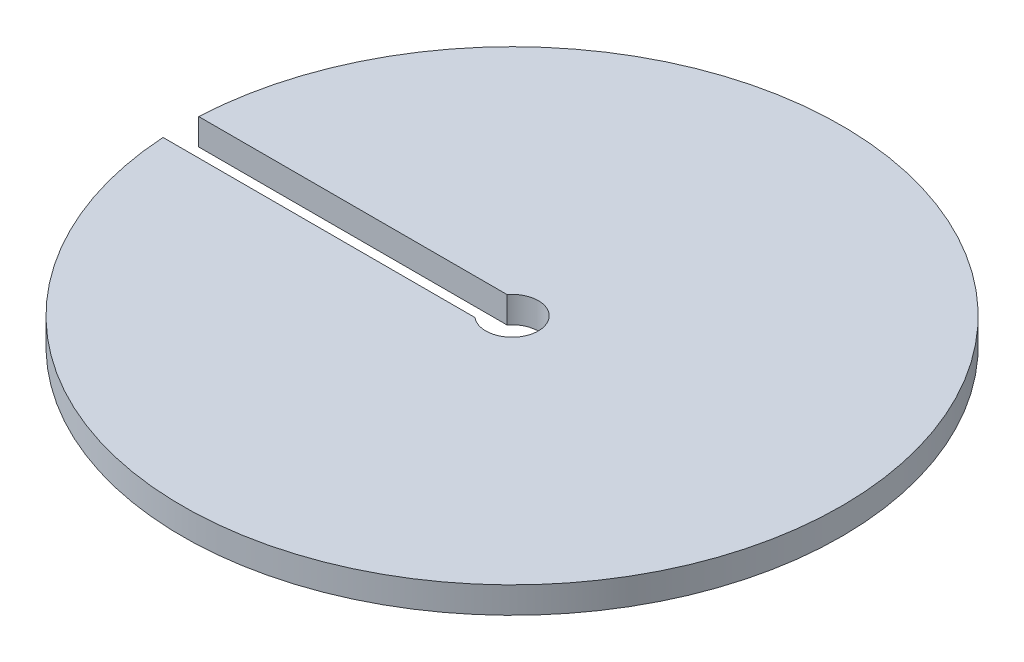
ISO-10303-21;
HEADER;
FILE_DESCRIPTION(('STEP AP214'),'2;1');
FILE_NAME('part.step','',(''),(''),'','','');
FILE_SCHEMA(('AUTOMOTIVE_DESIGN { 1 0 10303 214 1 1 1 1 }'));
ENDSEC;
DATA;
#1=APPLICATION_CONTEXT('core data for automotive mechanical design processes');
#2=APPLICATION_PROTOCOL_DEFINITION('international standard','automotive_design',2000,#1);
#3=PRODUCT_CONTEXT('',#1,'mechanical');
#4=PRODUCT('Part','Part','',(#3));
#5=PRODUCT_RELATED_PRODUCT_CATEGORY('part','',(#4));
#6=PRODUCT_DEFINITION_FORMATION('','',#4);
#7=PRODUCT_DEFINITION_CONTEXT('part definition',#1,'design');
#8=PRODUCT_DEFINITION('design','',#6,#7);
#9=PRODUCT_DEFINITION_SHAPE('','',#8);
#10=(LENGTH_UNIT() NAMED_UNIT(*) SI_UNIT(.MILLI.,.METRE.));
#11=(NAMED_UNIT(*) PLANE_ANGLE_UNIT() SI_UNIT($,.RADIAN.));
#12=(NAMED_UNIT(*) SI_UNIT($,.STERADIAN.) SOLID_ANGLE_UNIT());
#13=UNCERTAINTY_MEASURE_WITH_UNIT(LENGTH_MEASURE(1.E-05),#10,'distance_accuracy_value','');
#14=(GEOMETRIC_REPRESENTATION_CONTEXT(3) GLOBAL_UNCERTAINTY_ASSIGNED_CONTEXT((#13)) GLOBAL_UNIT_ASSIGNED_CONTEXT((#10,
#11,#12)) REPRESENTATION_CONTEXT('',''));
#15=CARTESIAN_POINT('',(0.,0.,0.));
#16=DIRECTION('',(0.,0.,1.));
#17=DIRECTION('',(1.,0.,0.));
#18=AXIS2_PLACEMENT_3D('',#15,#16,#17);
#19=CARTESIAN_POINT('',(0.,5.,0.));
#20=DIRECTION('',(0.,-1.,0.));
#21=DIRECTION('',(0.,0.,-1.));
#22=AXIS2_PLACEMENT_3D('',#19,#20,#21);
#23=CYLINDRICAL_SURFACE('',#22,9.95979894215134);
#24=CARTESIAN_POINT('',(0.,-5.,0.));
#25=DIRECTION('',(0.,-1.,0.));
#26=DIRECTION('',(0.,0.,1.));
#27=AXIS2_PLACEMENT_3D('',#24,#25,#26);
#28=CIRCLE('',#27,9.95979894215134);
#29=CARTESIAN_POINT('',(-7.93143782079847,-5.,-6.02410898497749));
#30=VERTEX_POINT('',#29);
#31=CARTESIAN_POINT('',(-6.43909884814143,-5.,7.59839463254856));
#32=VERTEX_POINT('',#31);
#33=EDGE_CURVE('E107',#30,#32,#28,.T.);
#34=ORIENTED_EDGE('',*,*,#33,.T.);
#35=DIRECTION('',(0.,-1.,0.));
#36=VECTOR('',#35,1.);
#37=CARTESIAN_POINT('',(-6.43909884814143,5.,7.59839463254856));
#38=LINE('',#37,#36);
#39=CARTESIAN_POINT('',(-6.43909884814143,5.,7.59839463254856));
#40=VERTEX_POINT('',#39);
#41=EDGE_CURVE('E11',#40,#32,#38,.T.);
#42=ORIENTED_EDGE('',*,*,#41,.F.);
#43=CARTESIAN_POINT('',(0.,5.,0.));
#44=DIRECTION('',(0.,-1.,0.));
#45=DIRECTION('',(0.,0.,1.));
#46=AXIS2_PLACEMENT_3D('',#43,#44,#45);
#47=CIRCLE('',#46,9.95979894215134);
#48=CARTESIAN_POINT('',(-7.93143782079847,5.,-6.02410898497749));
#49=VERTEX_POINT('',#48);
#50=EDGE_CURVE('E91',#49,#40,#47,.T.);
#51=ORIENTED_EDGE('',*,*,#50,.F.);
#52=DIRECTION('',(0.,-1.,0.));
#53=VECTOR('',#52,1.);
#54=CARTESIAN_POINT('',(-7.93143782079847,5.,-6.02410898497749));
#55=LINE('',#54,#53);
#56=EDGE_CURVE('E103',#49,#30,#55,.T.);
#57=ORIENTED_EDGE('',*,*,#56,.T.);
#58=EDGE_LOOP('',(#34,#42,#51,#57));
#59=FACE_BOUND('',#58,.T.);
#60=ADVANCED_FACE('F39',(#59),#23,.F.);
#61=CARTESIAN_POINT('',(-6.43909884814143,5.,7.59839463254856));
#62=DIRECTION('',(0.,0.,1.));
#63=DIRECTION('',(1.,0.,0.));
#64=AXIS2_PLACEMENT_3D('',#61,#62,#63);
#65=PLANE('',#64);
#66=DIRECTION('',(-1.,0.,0.));
#67=VECTOR('',#66,1.);
#68=CARTESIAN_POINT('',(-6.43909884814143,-5.,7.59839463254856));
#69=LINE('',#68,#67);
#70=CARTESIAN_POINT('',(-124.768843863394,-5.,7.59839463254856));
#71=VERTEX_POINT('',#70);
#72=EDGE_CURVE('E96',#32,#71,#69,.T.);
#73=ORIENTED_EDGE('',*,*,#72,.T.);
#74=DIRECTION('',(0.,-1.,0.));
#75=VECTOR('',#74,1.);
#76=CARTESIAN_POINT('',(-124.768843863394,5.,7.59839463254856));
#77=LINE('',#76,#75);
#78=CARTESIAN_POINT('',(-124.768843863394,5.,7.59839463254856));
#79=VERTEX_POINT('',#78);
#80=EDGE_CURVE('E48',#79,#71,#77,.T.);
#81=ORIENTED_EDGE('',*,*,#80,.F.);
#82=DIRECTION('',(-1.,0.,0.));
#83=VECTOR('',#82,1.);
#84=CARTESIAN_POINT('',(-6.43909884814143,5.,7.59839463254856));
#85=LINE('',#84,#83);
#86=EDGE_CURVE('E86',#40,#79,#85,.T.);
#87=ORIENTED_EDGE('',*,*,#86,.F.);
#88=ORIENTED_EDGE('',*,*,#41,.T.);
#89=EDGE_LOOP('',(#73,#81,#87,#88));
#90=FACE_BOUND('',#89,.T.);
#91=ADVANCED_FACE('F95',(#90),#65,.F.);
#92=CARTESIAN_POINT('',(0.,5.,0.));
#93=DIRECTION('',(0.,-1.,0.));
#94=DIRECTION('',(0.,0.,-1.));
#95=AXIS2_PLACEMENT_3D('',#92,#93,#94);
#96=CYLINDRICAL_SURFACE('',#95,125.);
#97=CARTESIAN_POINT('',(0.,-5.,0.));
#98=DIRECTION('',(0.,1.,0.));
#99=DIRECTION('',(0.,0.,1.));
#100=AXIS2_PLACEMENT_3D('',#97,#98,#99);
#101=CIRCLE('',#100,125.);
#102=CARTESIAN_POINT('',(-124.854756060541,-5.,-6.02410898497753));
#103=VERTEX_POINT('',#102);
#104=EDGE_CURVE('E73',#71,#103,#101,.T.);
#105=ORIENTED_EDGE('',*,*,#104,.T.);
#106=DIRECTION('',(0.,-1.,0.));
#107=VECTOR('',#106,1.);
#108=CARTESIAN_POINT('',(-124.854756060541,5.,-6.02410898497753));
#109=LINE('',#108,#107);
#110=CARTESIAN_POINT('',(-124.854756060541,5.,-6.02410898497753));
#111=VERTEX_POINT('',#110);
#112=EDGE_CURVE('E98',#111,#103,#109,.T.);
#113=ORIENTED_EDGE('',*,*,#112,.F.);
#114=CARTESIAN_POINT('',(0.,5.,0.));
#115=DIRECTION('',(0.,1.,0.));
#116=DIRECTION('',(0.,0.,1.));
#117=AXIS2_PLACEMENT_3D('',#114,#115,#116);
#118=CIRCLE('',#117,125.);
#119=EDGE_CURVE('E89',#79,#111,#118,.T.);
#120=ORIENTED_EDGE('',*,*,#119,.F.);
#121=ORIENTED_EDGE('',*,*,#80,.T.);
#122=EDGE_LOOP('',(#105,#113,#120,#121));
#123=FACE_BOUND('',#122,.T.);
#124=ADVANCED_FACE('F99',(#123),#96,.T.);
#125=CARTESIAN_POINT('',(-7.93143782079847,5.,-6.02410898497749));
#126=DIRECTION('',(0.,0.,-1.));
#127=DIRECTION('',(-1.,0.,0.));
#128=AXIS2_PLACEMENT_3D('',#125,#126,#127);
#129=PLANE('',#128);
#130=DIRECTION('',(1.,0.,0.));
#131=VECTOR('',#130,1.);
#132=CARTESIAN_POINT('',(-7.93143782079847,-5.,-6.02410898497749));
#133=LINE('',#132,#131);
#134=EDGE_CURVE('E79',#103,#30,#133,.T.);
#135=ORIENTED_EDGE('',*,*,#134,.T.);
#136=ORIENTED_EDGE('',*,*,#56,.F.);
#137=DIRECTION('',(1.,0.,0.));
#138=VECTOR('',#137,1.);
#139=CARTESIAN_POINT('',(-7.93143782079847,5.,-6.02410898497749));
#140=LINE('',#139,#138);
#141=EDGE_CURVE('E56',#111,#49,#140,.T.);
#142=ORIENTED_EDGE('',*,*,#141,.F.);
#143=ORIENTED_EDGE('',*,*,#112,.T.);
#144=EDGE_LOOP('',(#135,#136,#142,#143));
#145=FACE_BOUND('',#144,.T.);
#146=ADVANCED_FACE('F120',(#145),#129,.F.);
#147=CARTESIAN_POINT('',(0.,5.,0.));
#148=DIRECTION('',(0.,1.,0.));
#149=DIRECTION('',(0.,0.,1.));
#150=AXIS2_PLACEMENT_3D('',#147,#148,#149);
#151=PLANE('',#150);
#152=ORIENTED_EDGE('',*,*,#50,.T.);
#153=ORIENTED_EDGE('',*,*,#86,.T.);
#154=ORIENTED_EDGE('',*,*,#119,.T.);
#155=ORIENTED_EDGE('',*,*,#141,.T.);
#156=EDGE_LOOP('',(#152,#153,#154,#155));
#157=FACE_BOUND('',#156,.T.);
#158=ADVANCED_FACE('F87',(#157),#151,.T.);
#159=CARTESIAN_POINT('',(0.,-5.,0.));
#160=DIRECTION('',(0.,1.,0.));
#161=DIRECTION('',(0.,0.,1.));
#162=AXIS2_PLACEMENT_3D('',#159,#160,#161);
#163=PLANE('',#162);
#164=ORIENTED_EDGE('',*,*,#33,.F.);
#165=ORIENTED_EDGE('',*,*,#134,.F.);
#166=ORIENTED_EDGE('',*,*,#104,.F.);
#167=ORIENTED_EDGE('',*,*,#72,.F.);
#168=EDGE_LOOP('',(#164,#165,#166,#167));
#169=FACE_BOUND('',#168,.T.);
#170=ADVANCED_FACE('F123',(#169),#163,.F.);
#171=CLOSED_SHELL('',(#60,#91,#124,#146,#158,#170));
#172=MANIFOLD_SOLID_BREP('B2',#171);
#173=ADVANCED_BREP_SHAPE_REPRESENTATION('',(#18,#172),#14);
#174=SHAPE_DEFINITION_REPRESENTATION(#9,#173);
ENDSEC;
END-ISO-10303-21;
